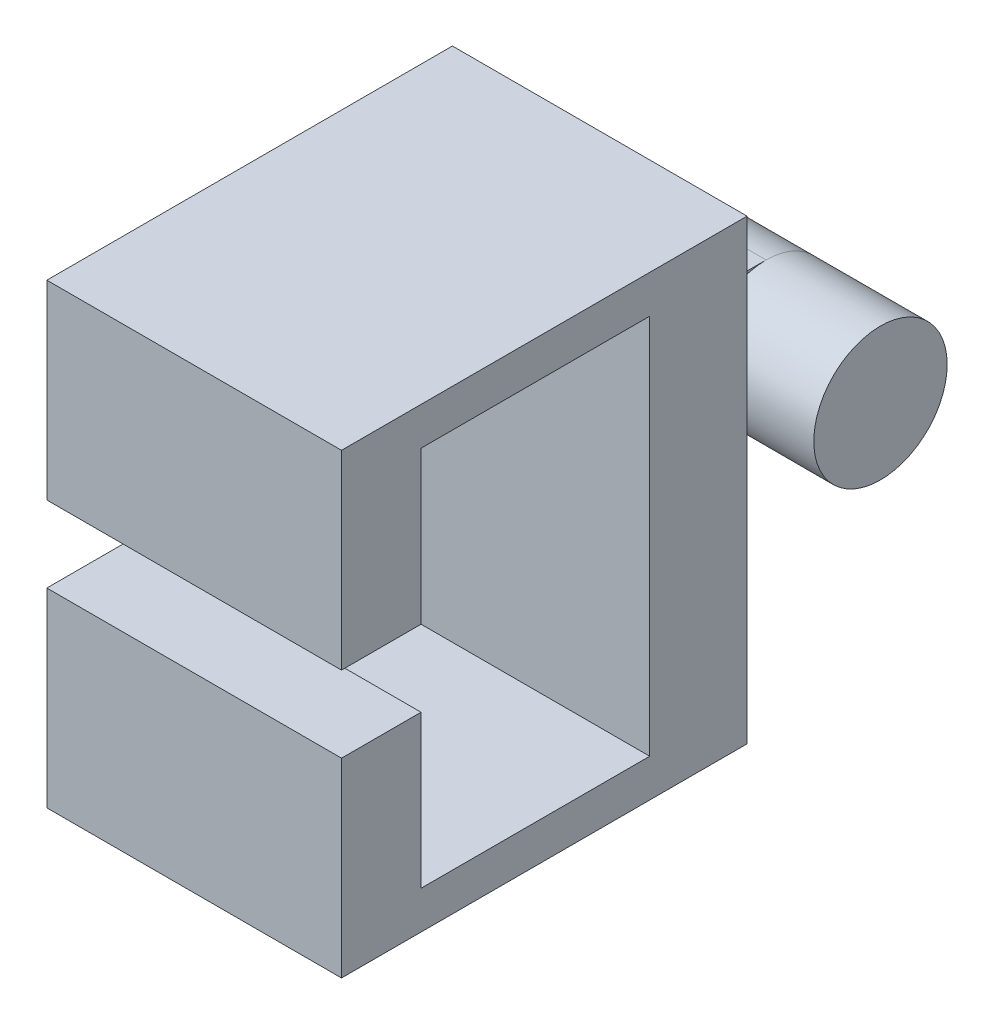
ISO-10303-21;
HEADER;
FILE_DESCRIPTION(('STEP AP214'),'2;1');
FILE_NAME('part.step','',(''),(''),'','','');
FILE_SCHEMA(('AUTOMOTIVE_DESIGN { 1 0 10303 214 1 1 1 1 }'));
ENDSEC;
DATA;
#1=APPLICATION_CONTEXT('core data for automotive mechanical design processes');
#2=APPLICATION_PROTOCOL_DEFINITION('international standard','automotive_design',2000,#1);
#3=PRODUCT_CONTEXT('',#1,'mechanical');
#4=PRODUCT('Part','Part','',(#3));
#5=PRODUCT_RELATED_PRODUCT_CATEGORY('part','',(#4));
#6=PRODUCT_DEFINITION_FORMATION('','',#4);
#7=PRODUCT_DEFINITION_CONTEXT('part definition',#1,'design');
#8=PRODUCT_DEFINITION('design','',#6,#7);
#9=PRODUCT_DEFINITION_SHAPE('','',#8);
#10=(LENGTH_UNIT() NAMED_UNIT(*) SI_UNIT(.MILLI.,.METRE.));
#11=(NAMED_UNIT(*) PLANE_ANGLE_UNIT() SI_UNIT($,.RADIAN.));
#12=(NAMED_UNIT(*) SI_UNIT($,.STERADIAN.) SOLID_ANGLE_UNIT());
#13=UNCERTAINTY_MEASURE_WITH_UNIT(LENGTH_MEASURE(1.E-05),#10,'distance_accuracy_value','');
#14=(GEOMETRIC_REPRESENTATION_CONTEXT(3) GLOBAL_UNCERTAINTY_ASSIGNED_CONTEXT((#13)) GLOBAL_UNIT_ASSIGNED_CONTEXT((#10,
#11,#12)) REPRESENTATION_CONTEXT('',''));
#15=CARTESIAN_POINT('',(0.,0.,0.));
#16=DIRECTION('',(0.,0.,1.));
#17=DIRECTION('',(1.,0.,0.));
#18=AXIS2_PLACEMENT_3D('',#15,#16,#17);
#19=CARTESIAN_POINT('',(-39.5744554770151,-38.0746,16.2252632687768));
#20=DIRECTION('',(0.,0.,1.));
#21=DIRECTION('',(1.,0.,0.));
#22=AXIS2_PLACEMENT_3D('',#19,#20,#21);
#23=PLANE('',#22);
#24=DIRECTION('',(1.,0.,0.));
#25=VECTOR('',#24,1.);
#26=CARTESIAN_POINT('',(-39.5744554770151,31.75,16.2252632687768));
#27=LINE('',#26,#25);
#28=CARTESIAN_POINT('',(-39.5744554770151,31.75,16.2252632687768));
#29=VERTEX_POINT('',#28);
#30=CARTESIAN_POINT('',(9.525,31.75,16.2252632687768));
#31=VERTEX_POINT('',#30);
#32=EDGE_CURVE('E252',#29,#31,#27,.T.);
#33=ORIENTED_EDGE('',*,*,#32,.F.);
#34=DIRECTION('',(0.,-1.,0.));
#35=VECTOR('',#34,1.);
#36=CARTESIAN_POINT('',(-39.5744554770151,-38.0746,16.2252632687768));
#37=LINE('',#36,#35);
#38=CARTESIAN_POINT('',(-39.5744554770151,-31.75,16.2252632687768));
#39=VERTEX_POINT('',#38);
#40=EDGE_CURVE('E263',#29,#39,#37,.T.);
#41=ORIENTED_EDGE('',*,*,#40,.T.);
#42=DIRECTION('',(1.,0.,0.));
#43=VECTOR('',#42,1.);
#44=CARTESIAN_POINT('',(-39.5744554770151,-31.75,16.2252632687768));
#45=LINE('',#44,#43);
#46=CARTESIAN_POINT('',(9.525,-31.75,16.2252632687768));
#47=VERTEX_POINT('',#46);
#48=EDGE_CURVE('E249',#39,#47,#45,.T.);
#49=ORIENTED_EDGE('',*,*,#48,.T.);
#50=DIRECTION('',(0.,-1.,0.));
#51=VECTOR('',#50,1.);
#52=CARTESIAN_POINT('',(9.525,-38.0746,16.2252632687768));
#53=LINE('',#52,#51);
#54=EDGE_CURVE('E251',#31,#47,#53,.T.);
#55=ORIENTED_EDGE('',*,*,#54,.F.);
#56=EDGE_LOOP('',(#33,#41,#49,#55));
#57=FACE_BOUND('',#56,.T.);
#58=ADVANCED_FACE('F50',(#57),#23,.T.);
#59=CARTESIAN_POINT('',(-39.5744554770151,0.,-22.2257396140967));
#60=DIRECTION('',(-1.,0.,0.));
#61=DIRECTION('',(0.,0.,1.));
#62=AXIS2_PLACEMENT_3D('',#59,#60,#61);
#63=CYLINDRICAL_SURFACE('',#62,11.1128698070484);
#64=DIRECTION('',(1.,0.,0.));
#65=VECTOR('',#64,1.);
#66=CARTESIAN_POINT('',(-39.5744554770151,0.,-33.3386094211451));
#67=LINE('',#66,#65);
#68=CARTESIAN_POINT('',(-39.5744554770151,0.,-33.3386094211451));
#69=VERTEX_POINT('',#68);
#70=CARTESIAN_POINT('',(-9.525,0.,-33.3386094211451));
#71=VERTEX_POINT('',#70);
#72=EDGE_CURVE('E303',#69,#71,#67,.T.);
#73=ORIENTED_EDGE('',*,*,#72,.T.);
#74=CARTESIAN_POINT('',(-9.525,0.,-22.2257396140967));
#75=DIRECTION('',(1.,0.,0.));
#76=DIRECTION('',(0.,0.,-1.));
#77=AXIS2_PLACEMENT_3D('',#74,#75,#76);
#78=CIRCLE('',#77,11.1128698070484);
#79=CARTESIAN_POINT('',(-9.525,-11.1128698070484,-22.2257396140967));
#80=VERTEX_POINT('',#79);
#81=EDGE_CURVE('E300',#80,#71,#78,.T.);
#82=ORIENTED_EDGE('',*,*,#81,.F.);
#83=DIRECTION('',(-1.,0.,0.));
#84=VECTOR('',#83,1.);
#85=CARTESIAN_POINT('',(-39.5744554770151,-11.1128698070484,-22.2257396140967));
#86=LINE('',#85,#84);
#87=CARTESIAN_POINT('',(-39.5744554770151,-11.1128698070484,-22.2257396140967));
#88=VERTEX_POINT('',#87);
#89=EDGE_CURVE('E313',#88,#80,#86,.F.);
#90=ORIENTED_EDGE('',*,*,#89,.F.);
#91=CARTESIAN_POINT('',(-39.5744554770151,0.,-22.2257396140967));
#92=DIRECTION('',(1.,0.,0.));
#93=DIRECTION('',(0.,0.,-1.));
#94=AXIS2_PLACEMENT_3D('',#91,#92,#93);
#95=CIRCLE('',#94,11.1128698070484);
#96=EDGE_CURVE('E320',#69,#88,#95,.F.);
#97=ORIENTED_EDGE('',*,*,#96,.F.);
#98=EDGE_LOOP('',(#73,#82,#90,#97));
#99=FACE_BOUND('',#98,.T.);
#100=ADVANCED_FACE('F402',(#99),#63,.T.);
#101=CARTESIAN_POINT('',(-39.5744554770151,0.,-22.2257396140967));
#102=DIRECTION('',(-1.,0.,0.));
#103=DIRECTION('',(0.,0.,1.));
#104=AXIS2_PLACEMENT_3D('',#101,#102,#103);
#105=CYLINDRICAL_SURFACE('',#104,11.1128698070484);
#106=ORIENTED_EDGE('',*,*,#72,.F.);
#107=CARTESIAN_POINT('',(-39.5744554770151,0.,-22.2257396140967));
#108=DIRECTION('',(1.,0.,0.));
#109=DIRECTION('',(0.,0.,-1.));
#110=AXIS2_PLACEMENT_3D('',#107,#108,#109);
#111=CIRCLE('',#110,11.1128698070484);
#112=CARTESIAN_POINT('',(-39.5744554770151,11.1128698070484,-22.2257396140967));
#113=VERTEX_POINT('',#112);
#114=EDGE_CURVE('E315',#113,#69,#111,.F.);
#115=ORIENTED_EDGE('',*,*,#114,.F.);
#116=DIRECTION('',(1.,0.,0.));
#117=VECTOR('',#116,1.);
#118=CARTESIAN_POINT('',(-39.5744554770151,11.1128698070484,-22.2257396140967));
#119=LINE('',#118,#117);
#120=CARTESIAN_POINT('',(-9.525,11.1128698070484,-22.2257396140967));
#121=VERTEX_POINT('',#120);
#122=EDGE_CURVE('E307',#121,#113,#119,.F.);
#123=ORIENTED_EDGE('',*,*,#122,.F.);
#124=EDGE_CURVE('E302',#71,#121,#78,.T.);
#125=ORIENTED_EDGE('',*,*,#124,.F.);
#126=EDGE_LOOP('',(#106,#115,#123,#125));
#127=FACE_BOUND('',#126,.T.);
#128=ADVANCED_FACE('F400',(#127),#105,.T.);
#129=CARTESIAN_POINT('',(9.525,0.,-22.2257396140967));
#130=DIRECTION('',(-1.,0.,0.));
#131=DIRECTION('',(0.,0.,1.));
#132=AXIS2_PLACEMENT_3D('',#129,#130,#131);
#133=CYLINDRICAL_SURFACE('',#132,11.1128698070484);
#134=CARTESIAN_POINT('',(9.525,0.,-22.2257396140967));
#135=DIRECTION('',(1.,0.,0.));
#136=DIRECTION('',(0.,0.,-1.));
#137=AXIS2_PLACEMENT_3D('',#134,#135,#136);
#138=CIRCLE('',#137,11.1128698070484);
#139=CARTESIAN_POINT('',(9.525,0.,-33.3386094211451));
#140=VERTEX_POINT('',#139);
#141=EDGE_CURVE('E297',#140,#140,#138,.T.);
#142=ORIENTED_EDGE('',*,*,#141,.F.);
#143=EDGE_LOOP('',(#142));
#144=FACE_BOUND('',#143,.T.);
#145=ORIENTED_EDGE('',*,*,#124,.T.);
#146=EDGE_CURVE('E310',#121,#80,#78,.T.);
#147=ORIENTED_EDGE('',*,*,#146,.T.);
#148=ORIENTED_EDGE('',*,*,#81,.T.);
#149=EDGE_LOOP('',(#145,#147,#148));
#150=FACE_BOUND('',#149,.T.);
#151=ADVANCED_FACE('F394',(#144,#150),#133,.T.);
#152=CARTESIAN_POINT('',(9.525,0.,-22.2257396140967));
#153=DIRECTION('',(1.,0.,0.));
#154=DIRECTION('',(0.,0.,-1.));
#155=AXIS2_PLACEMENT_3D('',#152,#153,#154);
#156=PLANE('',#155);
#157=ORIENTED_EDGE('',*,*,#141,.T.);
#158=EDGE_LOOP('',(#157));
#159=FACE_BOUND('',#158,.T.);
#160=ADVANCED_FACE('F421',(#159),#156,.T.);
#161=CARTESIAN_POINT('',(-9.525,0.,0.));
#162=DIRECTION('',(1.,0.,0.));
#163=DIRECTION('',(0.,0.,-1.));
#164=AXIS2_PLACEMENT_3D('',#161,#162,#163);
#165=PLANE('',#164);
#166=DIRECTION('',(0.,0.,-1.));
#167=VECTOR('',#166,1.);
#168=CARTESIAN_POINT('',(-9.525,11.1128698070484,0.));
#169=LINE('',#168,#167);
#170=CARTESIAN_POINT('',(-9.525,11.1128698070484,-9.525));
#171=VERTEX_POINT('',#170);
#172=EDGE_CURVE('E294',#171,#121,#169,.T.);
#173=ORIENTED_EDGE('',*,*,#172,.F.);
#174=DIRECTION('',(0.,-1.,0.));
#175=VECTOR('',#174,1.);
#176=CARTESIAN_POINT('',(-9.525,-11.1128698070484,-9.525));
#177=LINE('',#176,#175);
#178=CARTESIAN_POINT('',(-9.525,-11.1128698070484,-9.525));
#179=VERTEX_POINT('',#178);
#180=EDGE_CURVE('E75',#171,#179,#177,.T.);
#181=ORIENTED_EDGE('',*,*,#180,.T.);
#182=DIRECTION('',(0.,0.,-1.));
#183=VECTOR('',#182,1.);
#184=CARTESIAN_POINT('',(-9.525,-11.1128698070484,0.));
#185=LINE('',#184,#183);
#186=EDGE_CURVE('E289',#179,#80,#185,.T.);
#187=ORIENTED_EDGE('',*,*,#186,.T.);
#188=ORIENTED_EDGE('',*,*,#146,.F.);
#189=EDGE_LOOP('',(#173,#181,#187,#188));
#190=FACE_BOUND('',#189,.T.);
#191=ADVANCED_FACE('F386',(#190),#165,.T.);
#192=CARTESIAN_POINT('',(-39.5744554770151,11.1128698070484,0.));
#193=DIRECTION('',(0.,-1.,0.));
#194=DIRECTION('',(0.,0.,-1.));
#195=AXIS2_PLACEMENT_3D('',#192,#193,#194);
#196=PLANE('',#195);
#197=DIRECTION('',(0.,0.,-1.));
#198=VECTOR('',#197,1.);
#199=CARTESIAN_POINT('',(-39.5744554770151,11.1128698070484,0.));
#200=LINE('',#199,#198);
#201=CARTESIAN_POINT('',(-39.5744554770151,11.1128698070484,-9.525));
#202=VERTEX_POINT('',#201);
#203=EDGE_CURVE('E295',#202,#113,#200,.T.);
#204=ORIENTED_EDGE('',*,*,#203,.F.);
#205=DIRECTION('',(1.,0.,0.));
#206=VECTOR('',#205,1.);
#207=CARTESIAN_POINT('',(-39.5744554770151,11.1128698070484,-9.525));
#208=LINE('',#207,#206);
#209=EDGE_CURVE('E318',#202,#171,#208,.T.);
#210=ORIENTED_EDGE('',*,*,#209,.T.);
#211=ORIENTED_EDGE('',*,*,#172,.T.);
#212=ORIENTED_EDGE('',*,*,#122,.T.);
#213=EDGE_LOOP('',(#204,#210,#211,#212));
#214=FACE_BOUND('',#213,.T.);
#215=ADVANCED_FACE('F383',(#214),#196,.F.);
#216=CARTESIAN_POINT('',(-39.5744554770151,-11.1128698070484,0.));
#217=DIRECTION('',(0.,-1.,0.));
#218=DIRECTION('',(0.,0.,-1.));
#219=AXIS2_PLACEMENT_3D('',#216,#217,#218);
#220=PLANE('',#219);
#221=ORIENTED_EDGE('',*,*,#186,.F.);
#222=DIRECTION('',(1.,0.,0.));
#223=VECTOR('',#222,1.);
#224=CARTESIAN_POINT('',(-39.5744554770151,-11.1128698070484,-9.525));
#225=LINE('',#224,#223);
#226=CARTESIAN_POINT('',(-39.5744554770151,-11.1128698070484,-9.525));
#227=VERTEX_POINT('',#226);
#228=EDGE_CURVE('E62',#179,#227,#225,.F.);
#229=ORIENTED_EDGE('',*,*,#228,.T.);
#230=DIRECTION('',(0.,0.,-1.));
#231=VECTOR('',#230,1.);
#232=CARTESIAN_POINT('',(-39.5744554770151,-11.1128698070484,0.));
#233=LINE('',#232,#231);
#234=EDGE_CURVE('E292',#227,#88,#233,.T.);
#235=ORIENTED_EDGE('',*,*,#234,.T.);
#236=ORIENTED_EDGE('',*,*,#89,.T.);
#237=EDGE_LOOP('',(#221,#229,#235,#236));
#238=FACE_BOUND('',#237,.T.);
#239=ADVANCED_FACE('F405',(#238),#220,.T.);
#240=CARTESIAN_POINT('',(-39.5744554770151,0.,0.));
#241=DIRECTION('',(1.,0.,0.));
#242=DIRECTION('',(0.,0.,-1.));
#243=AXIS2_PLACEMENT_3D('',#240,#241,#242);
#244=PLANE('',#243);
#245=ORIENTED_EDGE('',*,*,#114,.T.);
#246=ORIENTED_EDGE('',*,*,#96,.T.);
#247=ORIENTED_EDGE('',*,*,#234,.F.);
#248=CARTESIAN_POINT('',(-39.5744554770151,-20.6378698070484,-9.525));
#249=DIRECTION('',(1.,0.,0.));
#250=DIRECTION('',(0.,0.,-1.));
#251=AXIS2_PLACEMENT_3D('',#248,#249,#250);
#252=CIRCLE('',#251,9.525);
#253=CARTESIAN_POINT('',(-39.5744554770151,-20.6378698070484,0.));
#254=VERTEX_POINT('',#253);
#255=EDGE_CURVE('E11',#227,#254,#252,.T.);
#256=ORIENTED_EDGE('',*,*,#255,.T.);
#257=DIRECTION('',(0.,1.,0.));
#258=VECTOR('',#257,1.);
#259=CARTESIAN_POINT('',(-39.5744554770151,-38.0746,0.));
#260=LINE('',#259,#258);
#261=CARTESIAN_POINT('',(-39.5744554770151,-38.0746,0.));
#262=VERTEX_POINT('',#261);
#263=EDGE_CURVE('E271',#262,#254,#260,.T.);
#264=ORIENTED_EDGE('',*,*,#263,.F.);
#265=DIRECTION('',(0.,0.,-1.));
#266=VECTOR('',#265,1.);
#267=CARTESIAN_POINT('',(-39.5744554770151,-38.0746,16.2252632687768));
#268=LINE('',#267,#266);
#269=CARTESIAN_POINT('',(-39.5744554770151,-38.0746,67.5775534189193));
#270=VERTEX_POINT('',#269);
#271=EDGE_CURVE('E268',#270,#262,#268,.T.);
#272=ORIENTED_EDGE('',*,*,#271,.F.);
#273=DIRECTION('',(0.,-1.,0.));
#274=VECTOR('',#273,1.);
#275=CARTESIAN_POINT('',(-39.5744554770151,-38.0746,67.5775534189193));
#276=LINE('',#275,#274);
#277=CARTESIAN_POINT('',(-39.5744554770151,-6.35,67.5775534189193));
#278=VERTEX_POINT('',#277);
#279=EDGE_CURVE('E231',#278,#270,#276,.T.);
#280=ORIENTED_EDGE('',*,*,#279,.F.);
#281=DIRECTION('',(0.,0.,1.));
#282=VECTOR('',#281,1.);
#283=CARTESIAN_POINT('',(-39.5744554770151,-6.35,67.5775534189193));
#284=LINE('',#283,#282);
#285=CARTESIAN_POINT('',(-39.5744554770151,-6.35,54.3252632687768));
#286=VERTEX_POINT('',#285);
#287=EDGE_CURVE('E223',#286,#278,#284,.T.);
#288=ORIENTED_EDGE('',*,*,#287,.F.);
#289=DIRECTION('',(0.,1.,0.));
#290=VECTOR('',#289,1.);
#291=CARTESIAN_POINT('',(-39.5744554770151,-38.0746,54.3252632687768));
#292=LINE('',#291,#290);
#293=CARTESIAN_POINT('',(-39.5744554770151,-31.75,54.3252632687768));
#294=VERTEX_POINT('',#293);
#295=EDGE_CURVE('E237',#294,#286,#292,.T.);
#296=ORIENTED_EDGE('',*,*,#295,.F.);
#297=DIRECTION('',(0.,0.,-1.));
#298=VECTOR('',#297,1.);
#299=CARTESIAN_POINT('',(-39.5744554770151,-31.75,0.));
#300=LINE('',#299,#298);
#301=EDGE_CURVE('E260',#294,#39,#300,.T.);
#302=ORIENTED_EDGE('',*,*,#301,.T.);
#303=ORIENTED_EDGE('',*,*,#40,.F.);
#304=DIRECTION('',(0.,0.,-1.));
#305=VECTOR('',#304,1.);
#306=CARTESIAN_POINT('',(-39.5744554770151,31.75,0.));
#307=LINE('',#306,#305);
#308=CARTESIAN_POINT('',(-39.5744554770151,31.75,54.3252632687768));
#309=VERTEX_POINT('',#308);
#310=EDGE_CURVE('E243',#309,#29,#307,.T.);
#311=ORIENTED_EDGE('',*,*,#310,.F.);
#312=DIRECTION('',(0.,1.,0.));
#313=VECTOR('',#312,1.);
#314=CARTESIAN_POINT('',(-39.5744554770151,6.35,54.3252632687768));
#315=LINE('',#314,#313);
#316=CARTESIAN_POINT('',(-39.5744554770151,6.35,54.3252632687768));
#317=VERTEX_POINT('',#316);
#318=EDGE_CURVE('E193',#317,#309,#315,.T.);
#319=ORIENTED_EDGE('',*,*,#318,.F.);
#320=DIRECTION('',(0.,0.,-1.));
#321=VECTOR('',#320,1.);
#322=CARTESIAN_POINT('',(-39.5744554770151,6.35,67.5775534189193));
#323=LINE('',#322,#321);
#324=CARTESIAN_POINT('',(-39.5744554770151,6.35,67.5775534189193));
#325=VERTEX_POINT('',#324);
#326=EDGE_CURVE('E182',#325,#317,#323,.T.);
#327=ORIENTED_EDGE('',*,*,#326,.F.);
#328=DIRECTION('',(0.,-1.,0.));
#329=VECTOR('',#328,1.);
#330=CARTESIAN_POINT('',(-39.5744554770151,6.35,67.5775534189193));
#331=LINE('',#330,#329);
#332=CARTESIAN_POINT('',(-39.5744554770151,38.0746,67.5775534189193));
#333=VERTEX_POINT('',#332);
#334=EDGE_CURVE('E196',#333,#325,#331,.T.);
#335=ORIENTED_EDGE('',*,*,#334,.F.);
#336=DIRECTION('',(0.,0.,1.));
#337=VECTOR('',#336,1.);
#338=CARTESIAN_POINT('',(-39.5744554770151,38.0746,16.2252632687768));
#339=LINE('',#338,#337);
#340=CARTESIAN_POINT('',(-39.5744554770151,38.0746,0.));
#341=VERTEX_POINT('',#340);
#342=EDGE_CURVE('E278',#341,#333,#339,.T.);
#343=ORIENTED_EDGE('',*,*,#342,.F.);
#344=CARTESIAN_POINT('',(-39.5744554770151,20.6378698070484,0.));
#345=VERTEX_POINT('',#344);
#346=EDGE_CURVE('E275',#345,#341,#260,.T.);
#347=ORIENTED_EDGE('',*,*,#346,.F.);
#348=CARTESIAN_POINT('',(-39.5744554770151,20.6378698070484,-9.525));
#349=DIRECTION('',(1.,0.,0.));
#350=DIRECTION('',(0.,0.,-1.));
#351=AXIS2_PLACEMENT_3D('',#348,#349,#350);
#352=CIRCLE('',#351,9.525);
#353=EDGE_CURVE('E57',#345,#202,#352,.T.);
#354=ORIENTED_EDGE('',*,*,#353,.T.);
#355=ORIENTED_EDGE('',*,*,#203,.T.);
#356=EDGE_LOOP('',(#245,#246,#247,#256,#264,#272,#280,#288,#296,#302,#303,#311,#319,#327,#335,
#343,#347,#354,#355));
#357=FACE_BOUND('',#356,.T.);
#358=ADVANCED_FACE('F200',(#357),#244,.F.);
#359=CARTESIAN_POINT('',(-39.5744554770151,-38.0746,0.));
#360=DIRECTION('',(0.,0.,-1.));
#361=DIRECTION('',(-1.,0.,0.));
#362=AXIS2_PLACEMENT_3D('',#359,#360,#361);
#363=PLANE('',#362);
#364=DIRECTION('',(0.,-1.,0.));
#365=VECTOR('',#364,1.);
#366=CARTESIAN_POINT('',(0.,11.1128698070484,0.));
#367=LINE('',#366,#365);
#368=CARTESIAN_POINT('',(0.,-20.6378698070484,0.));
#369=VERTEX_POINT('',#368);
#370=CARTESIAN_POINT('',(0.,20.6378698070484,0.));
#371=VERTEX_POINT('',#370);
#372=EDGE_CURVE('E324',#369,#371,#367,.F.);
#373=ORIENTED_EDGE('',*,*,#372,.T.);
#374=DIRECTION('',(1.,0.,0.));
#375=VECTOR('',#374,1.);
#376=CARTESIAN_POINT('',(-39.5744554770151,20.6378698070484,0.));
#377=LINE('',#376,#375);
#378=EDGE_CURVE('E330',#371,#345,#377,.F.);
#379=ORIENTED_EDGE('',*,*,#378,.T.);
#380=ORIENTED_EDGE('',*,*,#346,.T.);
#381=DIRECTION('',(1.,0.,0.));
#382=VECTOR('',#381,1.);
#383=CARTESIAN_POINT('',(-39.5744554770151,38.0746,0.));
#384=LINE('',#383,#382);
#385=CARTESIAN_POINT('',(9.525,38.0746,0.));
#386=VERTEX_POINT('',#385);
#387=EDGE_CURVE('E288',#341,#386,#384,.T.);
#388=ORIENTED_EDGE('',*,*,#387,.T.);
#389=DIRECTION('',(0.,1.,0.));
#390=VECTOR('',#389,1.);
#391=CARTESIAN_POINT('',(9.525,-38.0746,0.));
#392=LINE('',#391,#390);
#393=CARTESIAN_POINT('',(9.525,-38.0746,0.));
#394=VERTEX_POINT('',#393);
#395=EDGE_CURVE('E281',#394,#386,#392,.T.);
#396=ORIENTED_EDGE('',*,*,#395,.F.);
#397=DIRECTION('',(1.,0.,0.));
#398=VECTOR('',#397,1.);
#399=CARTESIAN_POINT('',(-39.5744554770151,-38.0746,0.));
#400=LINE('',#399,#398);
#401=EDGE_CURVE('E276',#262,#394,#400,.T.);
#402=ORIENTED_EDGE('',*,*,#401,.F.);
#403=ORIENTED_EDGE('',*,*,#263,.T.);
#404=DIRECTION('',(1.,0.,0.));
#405=VECTOR('',#404,1.);
#406=CARTESIAN_POINT('',(-9.525,-20.6378698070484,0.));
#407=LINE('',#406,#405);
#408=EDGE_CURVE('E321',#254,#369,#407,.T.);
#409=ORIENTED_EDGE('',*,*,#408,.T.);
#410=EDGE_LOOP('',(#373,#379,#380,#388,#396,#402,#403,#409));
#411=FACE_BOUND('',#410,.T.);
#412=ADVANCED_FACE('F347',(#411),#363,.T.);
#413=CARTESIAN_POINT('',(-39.5744554770151,38.0746,16.2252632687768));
#414=DIRECTION('',(0.,1.,0.));
#415=DIRECTION('',(0.,0.,1.));
#416=AXIS2_PLACEMENT_3D('',#413,#414,#415);
#417=PLANE('',#416);
#418=DIRECTION('',(0.,0.,1.));
#419=VECTOR('',#418,1.);
#420=CARTESIAN_POINT('',(9.525,38.0746,16.2252632687768));
#421=LINE('',#420,#419);
#422=CARTESIAN_POINT('',(9.525,38.0746,67.5775534189193));
#423=VERTEX_POINT('',#422);
#424=EDGE_CURVE('E267',#386,#423,#421,.T.);
#425=ORIENTED_EDGE('',*,*,#424,.F.);
#426=ORIENTED_EDGE('',*,*,#387,.F.);
#427=ORIENTED_EDGE('',*,*,#342,.T.);
#428=DIRECTION('',(1.,0.,0.));
#429=VECTOR('',#428,1.);
#430=CARTESIAN_POINT('',(-39.5744554770151,38.0746,67.5775534189193));
#431=LINE('',#430,#429);
#432=EDGE_CURVE('E207',#333,#423,#431,.T.);
#433=ORIENTED_EDGE('',*,*,#432,.T.);
#434=EDGE_LOOP('',(#425,#426,#427,#433));
#435=FACE_BOUND('',#434,.T.);
#436=ADVANCED_FACE('F378',(#435),#417,.T.);
#437=CARTESIAN_POINT('',(-39.5744554770151,-38.0746,16.2252632687768));
#438=DIRECTION('',(0.,-1.,0.));
#439=DIRECTION('',(0.,0.,-1.));
#440=AXIS2_PLACEMENT_3D('',#437,#438,#439);
#441=PLANE('',#440);
#442=DIRECTION('',(0.,0.,-1.));
#443=VECTOR('',#442,1.);
#444=CARTESIAN_POINT('',(9.525,-38.0746,16.2252632687768));
#445=LINE('',#444,#443);
#446=CARTESIAN_POINT('',(9.525,-38.0746,67.5775534189193));
#447=VERTEX_POINT('',#446);
#448=EDGE_CURVE('E282',#447,#394,#445,.T.);
#449=ORIENTED_EDGE('',*,*,#448,.F.);
#450=DIRECTION('',(1.,0.,0.));
#451=VECTOR('',#450,1.);
#452=CARTESIAN_POINT('',(-39.5744554770151,-38.0746,67.5775534189193));
#453=LINE('',#452,#451);
#454=EDGE_CURVE('E218',#270,#447,#453,.T.);
#455=ORIENTED_EDGE('',*,*,#454,.F.);
#456=ORIENTED_EDGE('',*,*,#271,.T.);
#457=ORIENTED_EDGE('',*,*,#401,.T.);
#458=EDGE_LOOP('',(#449,#455,#456,#457));
#459=FACE_BOUND('',#458,.T.);
#460=ADVANCED_FACE('F346',(#459),#441,.T.);
#461=CARTESIAN_POINT('',(9.525,0.,0.));
#462=DIRECTION('',(-1.,0.,0.));
#463=DIRECTION('',(0.,0.,1.));
#464=AXIS2_PLACEMENT_3D('',#461,#462,#463);
#465=PLANE('',#464);
#466=ORIENTED_EDGE('',*,*,#424,.T.);
#467=DIRECTION('',(0.,-1.,0.));
#468=VECTOR('',#467,1.);
#469=CARTESIAN_POINT('',(9.525,6.35,67.5775534189193));
#470=LINE('',#469,#468);
#471=CARTESIAN_POINT('',(9.525,6.35,67.5775534189193));
#472=VERTEX_POINT('',#471);
#473=EDGE_CURVE('E211',#423,#472,#470,.T.);
#474=ORIENTED_EDGE('',*,*,#473,.T.);
#475=DIRECTION('',(0.,0.,-1.));
#476=VECTOR('',#475,1.);
#477=CARTESIAN_POINT('',(9.525,6.35,67.5775534189193));
#478=LINE('',#477,#476);
#479=CARTESIAN_POINT('',(9.525,6.35,54.3252632687768));
#480=VERTEX_POINT('',#479);
#481=EDGE_CURVE('E184',#472,#480,#478,.T.);
#482=ORIENTED_EDGE('',*,*,#481,.T.);
#483=DIRECTION('',(0.,1.,0.));
#484=VECTOR('',#483,1.);
#485=CARTESIAN_POINT('',(9.525,6.35,54.3252632687768));
#486=LINE('',#485,#484);
#487=CARTESIAN_POINT('',(9.525,31.75,54.3252632687768));
#488=VERTEX_POINT('',#487);
#489=EDGE_CURVE('E210',#480,#488,#486,.T.);
#490=ORIENTED_EDGE('',*,*,#489,.T.);
#491=DIRECTION('',(0.,0.,-1.));
#492=VECTOR('',#491,1.);
#493=CARTESIAN_POINT('',(9.525,31.75,0.));
#494=LINE('',#493,#492);
#495=EDGE_CURVE('E250',#488,#31,#494,.T.);
#496=ORIENTED_EDGE('',*,*,#495,.T.);
#497=ORIENTED_EDGE('',*,*,#54,.T.);
#498=DIRECTION('',(0.,0.,-1.));
#499=VECTOR('',#498,1.);
#500=CARTESIAN_POINT('',(9.525,-31.75,0.));
#501=LINE('',#500,#499);
#502=CARTESIAN_POINT('',(9.525,-31.75,54.3252632687768));
#503=VERTEX_POINT('',#502);
#504=EDGE_CURVE('E219',#503,#47,#501,.T.);
#505=ORIENTED_EDGE('',*,*,#504,.F.);
#506=DIRECTION('',(0.,1.,0.));
#507=VECTOR('',#506,1.);
#508=CARTESIAN_POINT('',(9.525,-38.0746,54.3252632687768));
#509=LINE('',#508,#507);
#510=CARTESIAN_POINT('',(9.525,-6.35,54.3252632687768));
#511=VERTEX_POINT('',#510);
#512=EDGE_CURVE('E235',#503,#511,#509,.T.);
#513=ORIENTED_EDGE('',*,*,#512,.T.);
#514=DIRECTION('',(0.,0.,1.));
#515=VECTOR('',#514,1.);
#516=CARTESIAN_POINT('',(9.525,-6.35,67.5775534189193));
#517=LINE('',#516,#515);
#518=CARTESIAN_POINT('',(9.525,-6.35,67.5775534189193));
#519=VERTEX_POINT('',#518);
#520=EDGE_CURVE('E230',#511,#519,#517,.T.);
#521=ORIENTED_EDGE('',*,*,#520,.T.);
#522=DIRECTION('',(0.,-1.,0.));
#523=VECTOR('',#522,1.);
#524=CARTESIAN_POINT('',(9.525,-38.0746,67.5775534189193));
#525=LINE('',#524,#523);
#526=EDGE_CURVE('E214',#519,#447,#525,.T.);
#527=ORIENTED_EDGE('',*,*,#526,.T.);
#528=ORIENTED_EDGE('',*,*,#448,.T.);
#529=ORIENTED_EDGE('',*,*,#395,.T.);
#530=EDGE_LOOP('',(#466,#474,#482,#490,#496,#497,#505,#513,#521,#527,#528,#529));
#531=FACE_BOUND('',#530,.T.);
#532=ADVANCED_FACE('F374',(#531),#465,.F.);
#533=CARTESIAN_POINT('',(-39.5744554770151,-31.75,0.));
#534=DIRECTION('',(0.,-1.,0.));
#535=DIRECTION('',(0.,0.,-1.));
#536=AXIS2_PLACEMENT_3D('',#533,#534,#535);
#537=PLANE('',#536);
#538=ORIENTED_EDGE('',*,*,#504,.T.);
#539=ORIENTED_EDGE('',*,*,#48,.F.);
#540=ORIENTED_EDGE('',*,*,#301,.F.);
#541=DIRECTION('',(1.,0.,0.));
#542=VECTOR('',#541,1.);
#543=CARTESIAN_POINT('',(-39.5744554770151,-31.75,54.3252632687768));
#544=LINE('',#543,#542);
#545=EDGE_CURVE('E257',#294,#503,#544,.T.);
#546=ORIENTED_EDGE('',*,*,#545,.T.);
#547=EDGE_LOOP('',(#538,#539,#540,#546));
#548=FACE_BOUND('',#547,.T.);
#549=ADVANCED_FACE('F366',(#548),#537,.F.);
#550=CARTESIAN_POINT('',(-39.5744554770151,31.75,0.));
#551=DIRECTION('',(0.,-1.,0.));
#552=DIRECTION('',(0.,0.,-1.));
#553=AXIS2_PLACEMENT_3D('',#550,#551,#552);
#554=PLANE('',#553);
#555=ORIENTED_EDGE('',*,*,#495,.F.);
#556=DIRECTION('',(1.,0.,0.));
#557=VECTOR('',#556,1.);
#558=CARTESIAN_POINT('',(-39.5744554770151,31.75,54.3252632687768));
#559=LINE('',#558,#557);
#560=EDGE_CURVE('E246',#309,#488,#559,.T.);
#561=ORIENTED_EDGE('',*,*,#560,.F.);
#562=ORIENTED_EDGE('',*,*,#310,.T.);
#563=ORIENTED_EDGE('',*,*,#32,.T.);
#564=EDGE_LOOP('',(#555,#561,#562,#563));
#565=FACE_BOUND('',#564,.T.);
#566=ADVANCED_FACE('F369',(#565),#554,.T.);
#567=CARTESIAN_POINT('',(-39.5744554770151,6.35,67.5775534189193));
#568=DIRECTION('',(0.,0.,1.));
#569=DIRECTION('',(1.,0.,0.));
#570=AXIS2_PLACEMENT_3D('',#567,#568,#569);
#571=PLANE('',#570);
#572=ORIENTED_EDGE('',*,*,#473,.F.);
#573=ORIENTED_EDGE('',*,*,#432,.F.);
#574=ORIENTED_EDGE('',*,*,#334,.T.);
#575=DIRECTION('',(1.,0.,0.));
#576=VECTOR('',#575,1.);
#577=CARTESIAN_POINT('',(-39.5744554770151,6.35,67.5775534189193));
#578=LINE('',#577,#576);
#579=EDGE_CURVE('E179',#325,#472,#578,.T.);
#580=ORIENTED_EDGE('',*,*,#579,.T.);
#581=EDGE_LOOP('',(#572,#573,#574,#580));
#582=FACE_BOUND('',#581,.T.);
#583=ADVANCED_FACE('F202',(#582),#571,.T.);
#584=CARTESIAN_POINT('',(-39.5744554770151,6.35,54.3252632687768));
#585=DIRECTION('',(0.,0.,-1.));
#586=DIRECTION('',(-1.,0.,0.));
#587=AXIS2_PLACEMENT_3D('',#584,#585,#586);
#588=PLANE('',#587);
#589=ORIENTED_EDGE('',*,*,#318,.T.);
#590=ORIENTED_EDGE('',*,*,#560,.T.);
#591=ORIENTED_EDGE('',*,*,#489,.F.);
#592=DIRECTION('',(1.,0.,0.));
#593=VECTOR('',#592,1.);
#594=CARTESIAN_POINT('',(-39.5744554770151,6.35,54.3252632687768));
#595=LINE('',#594,#593);
#596=EDGE_CURVE('E188',#317,#480,#595,.T.);
#597=ORIENTED_EDGE('',*,*,#596,.F.);
#598=EDGE_LOOP('',(#589,#590,#591,#597));
#599=FACE_BOUND('',#598,.T.);
#600=ADVANCED_FACE('F373',(#599),#588,.T.);
#601=CARTESIAN_POINT('',(-39.5744554770151,6.35,67.5775534189193));
#602=DIRECTION('',(0.,-1.,0.));
#603=DIRECTION('',(0.,0.,-1.));
#604=AXIS2_PLACEMENT_3D('',#601,#602,#603);
#605=PLANE('',#604);
#606=ORIENTED_EDGE('',*,*,#481,.F.);
#607=ORIENTED_EDGE('',*,*,#579,.F.);
#608=ORIENTED_EDGE('',*,*,#326,.T.);
#609=ORIENTED_EDGE('',*,*,#596,.T.);
#610=EDGE_LOOP('',(#606,#607,#608,#609));
#611=FACE_BOUND('',#610,.T.);
#612=ADVANCED_FACE('F185',(#611),#605,.T.);
#613=CARTESIAN_POINT('',(-39.5744554770151,-38.0746,54.3252632687768));
#614=DIRECTION('',(0.,0.,-1.));
#615=DIRECTION('',(-1.,0.,0.));
#616=AXIS2_PLACEMENT_3D('',#613,#614,#615);
#617=PLANE('',#616);
#618=ORIENTED_EDGE('',*,*,#545,.F.);
#619=ORIENTED_EDGE('',*,*,#295,.T.);
#620=DIRECTION('',(1.,0.,0.));
#621=VECTOR('',#620,1.);
#622=CARTESIAN_POINT('',(-39.5744554770151,-6.35,54.3252632687768));
#623=LINE('',#622,#621);
#624=EDGE_CURVE('E222',#286,#511,#623,.T.);
#625=ORIENTED_EDGE('',*,*,#624,.T.);
#626=ORIENTED_EDGE('',*,*,#512,.F.);
#627=EDGE_LOOP('',(#618,#619,#625,#626));
#628=FACE_BOUND('',#627,.T.);
#629=ADVANCED_FACE('F363',(#628),#617,.T.);
#630=CARTESIAN_POINT('',(-39.5744554770151,-38.0746,67.5775534189193));
#631=DIRECTION('',(0.,0.,1.));
#632=DIRECTION('',(1.,0.,0.));
#633=AXIS2_PLACEMENT_3D('',#630,#631,#632);
#634=PLANE('',#633);
#635=ORIENTED_EDGE('',*,*,#526,.F.);
#636=DIRECTION('',(1.,0.,0.));
#637=VECTOR('',#636,1.);
#638=CARTESIAN_POINT('',(-39.5744554770151,-6.35,67.5775534189193));
#639=LINE('',#638,#637);
#640=EDGE_CURVE('E227',#278,#519,#639,.T.);
#641=ORIENTED_EDGE('',*,*,#640,.F.);
#642=ORIENTED_EDGE('',*,*,#279,.T.);
#643=ORIENTED_EDGE('',*,*,#454,.T.);
#644=EDGE_LOOP('',(#635,#641,#642,#643));
#645=FACE_BOUND('',#644,.T.);
#646=ADVANCED_FACE('F444',(#645),#634,.T.);
#647=CARTESIAN_POINT('',(-39.5744554770151,-6.35,67.5775534189193));
#648=DIRECTION('',(0.,1.,0.));
#649=DIRECTION('',(0.,0.,1.));
#650=AXIS2_PLACEMENT_3D('',#647,#648,#649);
#651=PLANE('',#650);
#652=ORIENTED_EDGE('',*,*,#520,.F.);
#653=ORIENTED_EDGE('',*,*,#624,.F.);
#654=ORIENTED_EDGE('',*,*,#287,.T.);
#655=ORIENTED_EDGE('',*,*,#640,.T.);
#656=EDGE_LOOP('',(#652,#653,#654,#655));
#657=FACE_BOUND('',#656,.T.);
#658=ADVANCED_FACE('F356',(#657),#651,.T.);
#659=CARTESIAN_POINT('',(-39.5744554770151,-20.6378698070484,-9.525));
#660=DIRECTION('',(-1.,0.,0.));
#661=DIRECTION('',(0.,0.,1.));
#662=AXIS2_PLACEMENT_3D('',#659,#660,#661);
#663=CYLINDRICAL_SURFACE('',#662,9.525);
#664=ORIENTED_EDGE('',*,*,#255,.F.);
#665=ORIENTED_EDGE('',*,*,#228,.F.);
#666=CARTESIAN_POINT('',(0.,-20.6378698070484,-9.525));
#667=DIRECTION('',(-0.707106781186547,-0.707106781186547,0.));
#668=DIRECTION('',(-0.707106781186547,0.707106781186547,0.));
#669=AXIS2_PLACEMENT_3D('',#666,#667,#668);
#670=ELLIPSE('',#669,13.4703841816037,9.525);
#671=EDGE_CURVE('E51',#369,#179,#670,.T.);
#672=ORIENTED_EDGE('',*,*,#671,.F.);
#673=ORIENTED_EDGE('',*,*,#408,.F.);
#674=EDGE_LOOP('',(#664,#665,#672,#673));
#675=FACE_BOUND('',#674,.T.);
#676=ADVANCED_FACE('F47',(#675),#663,.F.);
#677=CARTESIAN_POINT('',(0.,0.,-9.525));
#678=DIRECTION('',(0.,1.,0.));
#679=DIRECTION('',(0.,0.,1.));
#680=AXIS2_PLACEMENT_3D('',#677,#678,#679);
#681=CYLINDRICAL_SURFACE('',#680,9.525);
#682=ORIENTED_EDGE('',*,*,#671,.T.);
#683=ORIENTED_EDGE('',*,*,#180,.F.);
#684=CARTESIAN_POINT('',(0.,20.6378698070484,-9.525));
#685=DIRECTION('',(-0.707106781186547,0.707106781186547,0.));
#686=DIRECTION('',(0.707106781186547,0.707106781186547,0.));
#687=AXIS2_PLACEMENT_3D('',#684,#685,#686);
#688=ELLIPSE('',#687,13.4703841816037,9.525);
#689=EDGE_CURVE('E331',#371,#171,#688,.F.);
#690=ORIENTED_EDGE('',*,*,#689,.F.);
#691=ORIENTED_EDGE('',*,*,#372,.F.);
#692=EDGE_LOOP('',(#682,#683,#690,#691));
#693=FACE_BOUND('',#692,.T.);
#694=ADVANCED_FACE('F338',(#693),#681,.F.);
#695=CARTESIAN_POINT('',(-39.5744554770151,20.6378698070484,-9.525));
#696=DIRECTION('',(1.,0.,0.));
#697=DIRECTION('',(0.,0.,-1.));
#698=AXIS2_PLACEMENT_3D('',#695,#696,#697);
#699=CYLINDRICAL_SURFACE('',#698,9.525);
#700=ORIENTED_EDGE('',*,*,#353,.F.);
#701=ORIENTED_EDGE('',*,*,#378,.F.);
#702=ORIENTED_EDGE('',*,*,#689,.T.);
#703=ORIENTED_EDGE('',*,*,#209,.F.);
#704=EDGE_LOOP('',(#700,#701,#702,#703));
#705=FACE_BOUND('',#704,.T.);
#706=ADVANCED_FACE('F384',(#705),#699,.F.);
#707=CLOSED_SHELL('',(#58,#100,#128,#151,#160,#191,#215,#239,#358,#412,#436,#460,#532,#549,#566,
#583,#600,#612,#629,#646,#658,#676,#694,#706));
#708=MANIFOLD_SOLID_BREP('B2',#707);
#709=ADVANCED_BREP_SHAPE_REPRESENTATION('',(#18,#708),#14);
#710=SHAPE_DEFINITION_REPRESENTATION(#9,#709);
ENDSEC;
END-ISO-10303-21;
